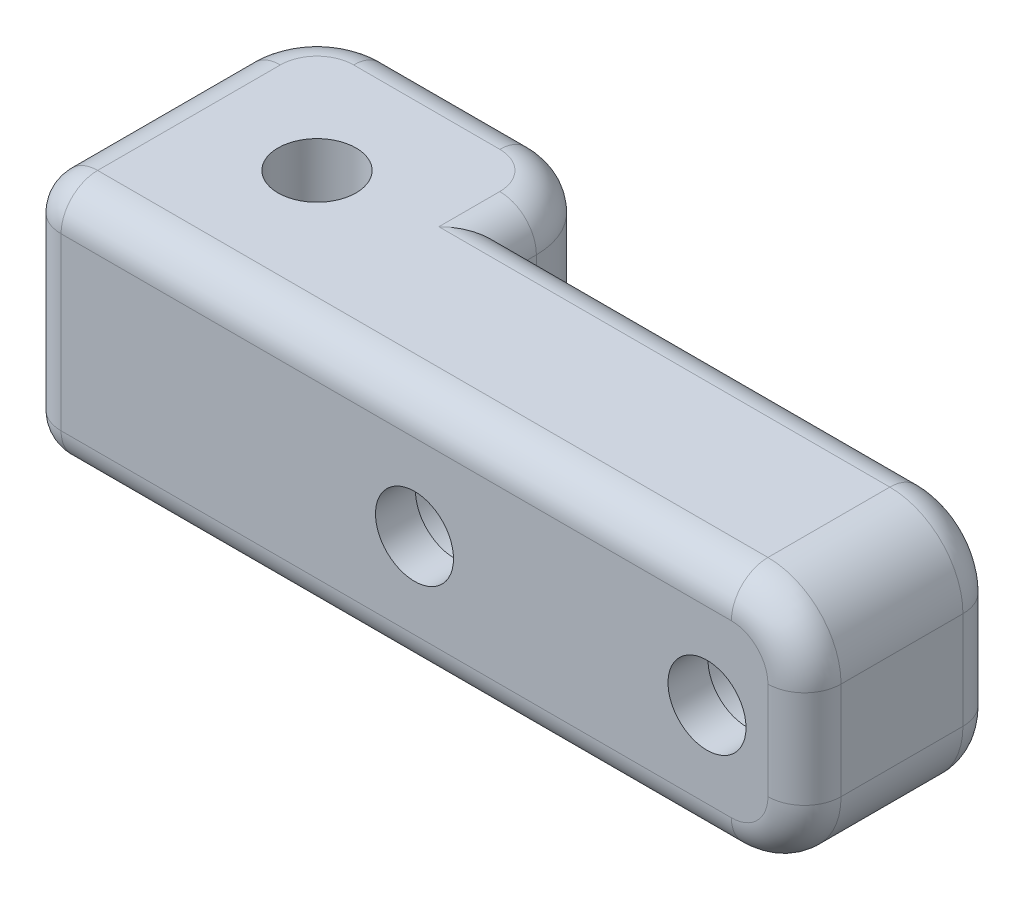
ISO-10303-21;
HEADER;
FILE_DESCRIPTION(('STEP AP214'),'2;1');
FILE_NAME('part.step','',(''),(''),'','','');
FILE_SCHEMA(('AUTOMOTIVE_DESIGN { 1 0 10303 214 1 1 1 1 }'));
ENDSEC;
DATA;
#1=APPLICATION_CONTEXT('core data for automotive mechanical design processes');
#2=APPLICATION_PROTOCOL_DEFINITION('international standard','automotive_design',2000,#1);
#3=PRODUCT_CONTEXT('',#1,'mechanical');
#4=PRODUCT('Part','Part','',(#3));
#5=PRODUCT_RELATED_PRODUCT_CATEGORY('part','',(#4));
#6=PRODUCT_DEFINITION_FORMATION('','',#4);
#7=PRODUCT_DEFINITION_CONTEXT('part definition',#1,'design');
#8=PRODUCT_DEFINITION('design','',#6,#7);
#9=PRODUCT_DEFINITION_SHAPE('','',#8);
#10=(LENGTH_UNIT() NAMED_UNIT(*) SI_UNIT(.MILLI.,.METRE.));
#11=(NAMED_UNIT(*) PLANE_ANGLE_UNIT() SI_UNIT($,.RADIAN.));
#12=(NAMED_UNIT(*) SI_UNIT($,.STERADIAN.) SOLID_ANGLE_UNIT());
#13=UNCERTAINTY_MEASURE_WITH_UNIT(LENGTH_MEASURE(1.E-05),#10,'distance_accuracy_value','');
#14=(GEOMETRIC_REPRESENTATION_CONTEXT(3) GLOBAL_UNCERTAINTY_ASSIGNED_CONTEXT((#13)) GLOBAL_UNIT_ASSIGNED_CONTEXT((#10,
#11,#12)) REPRESENTATION_CONTEXT('',''));
#15=CARTESIAN_POINT('',(0.,0.,0.));
#16=DIRECTION('',(0.,0.,1.));
#17=DIRECTION('',(1.,0.,0.));
#18=AXIS2_PLACEMENT_3D('',#15,#16,#17);
#19=CARTESIAN_POINT('',(12.,-10.,0.));
#20=DIRECTION('',(-1.,0.,0.));
#21=DIRECTION('',(0.,0.,1.));
#22=AXIS2_PLACEMENT_3D('',#19,#20,#21);
#23=PLANE('',#22);
#24=DIRECTION('',(0.,-1.,0.));
#25=VECTOR('',#24,1.);
#26=CARTESIAN_POINT('',(12.,-10.,-8.));
#27=LINE('',#26,#25);
#28=CARTESIAN_POINT('',(12.,-1.5,-8.));
#29=VERTEX_POINT('',#28);
#30=CARTESIAN_POINT('',(12.,-8.5,-8.));
#31=VERTEX_POINT('',#30);
#32=EDGE_CURVE('E502',#29,#31,#27,.T.);
#33=ORIENTED_EDGE('',*,*,#32,.T.);
#34=DIRECTION('',(0.,0.,-1.));
#35=VECTOR('',#34,1.);
#36=CARTESIAN_POINT('',(12.,-8.5,0.));
#37=LINE('',#36,#35);
#38=CARTESIAN_POINT('',(12.,-8.5,-9.));
#39=VERTEX_POINT('',#38);
#40=EDGE_CURVE('E232',#39,#31,#37,.F.);
#41=ORIENTED_EDGE('',*,*,#40,.F.);
#42=DIRECTION('',(0.,1.,0.));
#43=VECTOR('',#42,1.);
#44=CARTESIAN_POINT('',(12.,-10.,-9.));
#45=LINE('',#44,#43);
#46=CARTESIAN_POINT('',(12.,-1.5,-9.));
#47=VERTEX_POINT('',#46);
#48=EDGE_CURVE('E215',#47,#39,#45,.F.);
#49=ORIENTED_EDGE('',*,*,#48,.F.);
#50=DIRECTION('',(0.,0.,-1.));
#51=VECTOR('',#50,1.);
#52=CARTESIAN_POINT('',(12.,-1.5,-9.));
#53=LINE('',#52,#51);
#54=EDGE_CURVE('E224',#29,#47,#53,.T.);
#55=ORIENTED_EDGE('',*,*,#54,.F.);
#56=EDGE_LOOP('',(#33,#41,#49,#55));
#57=FACE_BOUND('',#56,.T.);
#58=ADVANCED_FACE('F47',(#57),#23,.F.);
#59=CARTESIAN_POINT('',(0.,-10.,0.));
#60=DIRECTION('',(1.,0.,0.));
#61=DIRECTION('',(0.,0.,-1.));
#62=AXIS2_PLACEMENT_3D('',#59,#60,#61);
#63=PLANE('',#62);
#64=DIRECTION('',(0.,1.,0.));
#65=VECTOR('',#64,1.);
#66=CARTESIAN_POINT('',(0.,-10.,-9.));
#67=LINE('',#66,#65);
#68=CARTESIAN_POINT('',(0.,-8.5,-9.));
#69=VERTEX_POINT('',#68);
#70=CARTESIAN_POINT('',(0.,-1.5,-9.));
#71=VERTEX_POINT('',#70);
#72=EDGE_CURVE('E505',#69,#71,#67,.T.);
#73=ORIENTED_EDGE('',*,*,#72,.F.);
#74=DIRECTION('',(0.,0.,1.));
#75=VECTOR('',#74,1.);
#76=CARTESIAN_POINT('',(0.,-8.5,0.));
#77=LINE('',#76,#75);
#78=CARTESIAN_POINT('',(0.,-8.5,-1.5));
#79=VERTEX_POINT('',#78);
#80=EDGE_CURVE('E57',#79,#69,#77,.F.);
#81=ORIENTED_EDGE('',*,*,#80,.F.);
#82=DIRECTION('',(0.,1.,0.));
#83=VECTOR('',#82,1.);
#84=CARTESIAN_POINT('',(0.,-10.,-1.5));
#85=LINE('',#84,#83);
#86=CARTESIAN_POINT('',(0.,-1.5,-1.5));
#87=VERTEX_POINT('',#86);
#88=EDGE_CURVE('E405',#87,#79,#85,.F.);
#89=ORIENTED_EDGE('',*,*,#88,.F.);
#90=DIRECTION('',(0.,0.,1.));
#91=VECTOR('',#90,1.);
#92=CARTESIAN_POINT('',(0.,-1.5,0.));
#93=LINE('',#92,#91);
#94=EDGE_CURVE('E11',#71,#87,#93,.T.);
#95=ORIENTED_EDGE('',*,*,#94,.F.);
#96=EDGE_LOOP('',(#73,#81,#89,#95));
#97=FACE_BOUND('',#96,.T.);
#98=ADVANCED_FACE('F537',(#97),#63,.F.);
#99=CARTESIAN_POINT('',(0.,-10.,0.));
#100=DIRECTION('',(0.,0.,-1.));
#101=DIRECTION('',(-1.,0.,0.));
#102=AXIS2_PLACEMENT_3D('',#99,#100,#101);
#103=PLANE('',#102);
#104=DIRECTION('',(0.,1.,0.));
#105=VECTOR('',#104,1.);
#106=CARTESIAN_POINT('',(1.5,-10.,0.));
#107=LINE('',#106,#105);
#108=CARTESIAN_POINT('',(1.5,-8.5,0.));
#109=VERTEX_POINT('',#108);
#110=CARTESIAN_POINT('',(1.5,-1.5,0.));
#111=VERTEX_POINT('',#110);
#112=EDGE_CURVE('E381',#109,#111,#107,.T.);
#113=ORIENTED_EDGE('',*,*,#112,.F.);
#114=DIRECTION('',(1.,0.,0.));
#115=VECTOR('',#114,1.);
#116=CARTESIAN_POINT('',(0.,-8.5,0.));
#117=LINE('',#116,#115);
#118=CARTESIAN_POINT('',(29.,-8.5,0.));
#119=VERTEX_POINT('',#118);
#120=EDGE_CURVE('E385',#119,#109,#117,.F.);
#121=ORIENTED_EDGE('',*,*,#120,.F.);
#122=CARTESIAN_POINT('',(29.,-7.,0.));
#123=DIRECTION('',(0.,0.,1.));
#124=DIRECTION('',(-1.,0.,0.));
#125=AXIS2_PLACEMENT_3D('',#122,#123,#124);
#126=CIRCLE('',#125,1.5);
#127=CARTESIAN_POINT('',(30.5,-7.,0.));
#128=VERTEX_POINT('',#127);
#129=EDGE_CURVE('E389',#128,#119,#126,.F.);
#130=ORIENTED_EDGE('',*,*,#129,.F.);
#131=DIRECTION('',(0.,1.,0.));
#132=VECTOR('',#131,1.);
#133=CARTESIAN_POINT('',(30.5,-7.,0.));
#134=LINE('',#133,#132);
#135=CARTESIAN_POINT('',(30.5,-3.,0.));
#136=VERTEX_POINT('',#135);
#137=EDGE_CURVE('E393',#136,#128,#134,.F.);
#138=ORIENTED_EDGE('',*,*,#137,.F.);
#139=CARTESIAN_POINT('',(29.,-3.,0.));
#140=DIRECTION('',(0.,0.,1.));
#141=DIRECTION('',(-1.,0.,0.));
#142=AXIS2_PLACEMENT_3D('',#139,#140,#141);
#143=CIRCLE('',#142,1.5);
#144=CARTESIAN_POINT('',(29.,-1.5,0.));
#145=VERTEX_POINT('',#144);
#146=EDGE_CURVE('E397',#145,#136,#143,.F.);
#147=ORIENTED_EDGE('',*,*,#146,.F.);
#148=DIRECTION('',(1.,0.,0.));
#149=VECTOR('',#148,1.);
#150=CARTESIAN_POINT('',(29.,-1.5,0.));
#151=LINE('',#150,#149);
#152=EDGE_CURVE('E401',#111,#145,#151,.T.);
#153=ORIENTED_EDGE('',*,*,#152,.F.);
#154=EDGE_LOOP('',(#113,#121,#130,#138,#147,#153));
#155=FACE_BOUND('',#154,.T.);
#156=CARTESIAN_POINT('',(28.,-5.,0.));
#157=DIRECTION('',(0.,0.,-1.));
#158=DIRECTION('',(1.,0.,0.));
#159=AXIS2_PLACEMENT_3D('',#156,#157,#158);
#160=CIRCLE('',#159,1.59999999999999);
#161=CARTESIAN_POINT('',(29.6,-5.,0.));
#162=VERTEX_POINT('',#161);
#163=EDGE_CURVE('E258',#162,#162,#160,.T.);
#164=ORIENTED_EDGE('',*,*,#163,.T.);
#165=EDGE_LOOP('',(#164));
#166=FACE_BOUND('',#165,.T.);
#167=CARTESIAN_POINT('',(16.,-5.,0.));
#168=DIRECTION('',(0.,0.,-1.));
#169=DIRECTION('',(1.,0.,0.));
#170=AXIS2_PLACEMENT_3D('',#167,#168,#169);
#171=CIRCLE('',#170,1.59999999999999);
#172=CARTESIAN_POINT('',(17.6,-5.,0.));
#173=VERTEX_POINT('',#172);
#174=EDGE_CURVE('E498',#173,#173,#171,.T.);
#175=ORIENTED_EDGE('',*,*,#174,.T.);
#176=EDGE_LOOP('',(#175));
#177=FACE_BOUND('',#176,.T.);
#178=ADVANCED_FACE('F601',(#155,#166,#177),#103,.F.);
#179=CARTESIAN_POINT('',(0.,-10.,-12.));
#180=DIRECTION('',(0.,0.,1.));
#181=DIRECTION('',(1.,0.,0.));
#182=AXIS2_PLACEMENT_3D('',#179,#180,#181);
#183=PLANE('',#182);
#184=DIRECTION('',(0.,1.,0.));
#185=VECTOR('',#184,1.);
#186=CARTESIAN_POINT('',(9.,-10.,-12.));
#187=LINE('',#186,#185);
#188=CARTESIAN_POINT('',(9.,-8.5,-12.));
#189=VERTEX_POINT('',#188);
#190=CARTESIAN_POINT('',(9.,-1.5,-12.));
#191=VERTEX_POINT('',#190);
#192=EDGE_CURVE('E218',#189,#191,#187,.T.);
#193=ORIENTED_EDGE('',*,*,#192,.F.);
#194=DIRECTION('',(-1.,0.,0.));
#195=VECTOR('',#194,1.);
#196=CARTESIAN_POINT('',(0.,-8.5,-12.));
#197=LINE('',#196,#195);
#198=CARTESIAN_POINT('',(3.,-8.5,-12.));
#199=VERTEX_POINT('',#198);
#200=EDGE_CURVE('E220',#199,#189,#197,.F.);
#201=ORIENTED_EDGE('',*,*,#200,.F.);
#202=DIRECTION('',(0.,1.,0.));
#203=VECTOR('',#202,1.);
#204=CARTESIAN_POINT('',(3.,-10.,-12.));
#205=LINE('',#204,#203);
#206=CARTESIAN_POINT('',(3.,-1.5,-12.));
#207=VERTEX_POINT('',#206);
#208=EDGE_CURVE('E247',#207,#199,#205,.F.);
#209=ORIENTED_EDGE('',*,*,#208,.F.);
#210=DIRECTION('',(-1.,0.,0.));
#211=VECTOR('',#210,1.);
#212=CARTESIAN_POINT('',(3.,-1.5,-12.));
#213=LINE('',#212,#211);
#214=EDGE_CURVE('E298',#191,#207,#213,.T.);
#215=ORIENTED_EDGE('',*,*,#214,.F.);
#216=EDGE_LOOP('',(#193,#201,#209,#215));
#217=FACE_BOUND('',#216,.T.);
#218=ADVANCED_FACE('F523',(#217),#183,.F.);
#219=CARTESIAN_POINT('',(0.,-10.,0.));
#220=DIRECTION('',(0.,1.,0.));
#221=DIRECTION('',(0.,0.,-1.));
#222=AXIS2_PLACEMENT_3D('',#219,#220,#221);
#223=PLANE('',#222);
#224=CARTESIAN_POINT('',(6.,-10.,-6.));
#225=DIRECTION('',(0.,1.,0.));
#226=DIRECTION('',(0.,0.,1.));
#227=AXIS2_PLACEMENT_3D('',#224,#225,#226);
#228=CIRCLE('',#227,2.20000000000001);
#229=CARTESIAN_POINT('',(6.,-10.,-3.79999999999999));
#230=VERTEX_POINT('',#229);
#231=EDGE_CURVE('E1039',#230,#230,#228,.T.);
#232=ORIENTED_EDGE('',*,*,#231,.T.);
#233=EDGE_LOOP('',(#232));
#234=FACE_BOUND('',#233,.T.);
#235=DIRECTION('',(0.,0.,1.));
#236=VECTOR('',#235,1.);
#237=CARTESIAN_POINT('',(29.,-10.,-8.));
#238=LINE('',#237,#236);
#239=CARTESIAN_POINT('',(29.,-10.,-1.5));
#240=VERTEX_POINT('',#239);
#241=CARTESIAN_POINT('',(29.,-10.,-6.5));
#242=VERTEX_POINT('',#241);
#243=EDGE_CURVE('E237',#240,#242,#238,.F.);
#244=ORIENTED_EDGE('',*,*,#243,.F.);
#245=DIRECTION('',(1.,0.,0.));
#246=VECTOR('',#245,1.);
#247=CARTESIAN_POINT('',(0.,-10.,-1.5));
#248=LINE('',#247,#246);
#249=CARTESIAN_POINT('',(1.5,-10.,-1.5));
#250=VERTEX_POINT('',#249);
#251=EDGE_CURVE('E353',#250,#240,#248,.T.);
#252=ORIENTED_EDGE('',*,*,#251,.F.);
#253=DIRECTION('',(0.,0.,1.));
#254=VECTOR('',#253,1.);
#255=CARTESIAN_POINT('',(1.5,-10.,0.));
#256=LINE('',#255,#254);
#257=CARTESIAN_POINT('',(1.5,-10.,-9.));
#258=VERTEX_POINT('',#257);
#259=EDGE_CURVE('E357',#258,#250,#256,.T.);
#260=ORIENTED_EDGE('',*,*,#259,.F.);
#261=CARTESIAN_POINT('',(3.,-10.,-9.));
#262=DIRECTION('',(0.,-1.,0.));
#263=DIRECTION('',(0.,0.,-1.));
#264=AXIS2_PLACEMENT_3D('',#261,#262,#263);
#265=CIRCLE('',#264,1.5);
#266=CARTESIAN_POINT('',(3.,-10.,-10.5));
#267=VERTEX_POINT('',#266);
#268=EDGE_CURVE('E361',#267,#258,#265,.F.);
#269=ORIENTED_EDGE('',*,*,#268,.F.);
#270=DIRECTION('',(-1.,0.,0.));
#271=VECTOR('',#270,1.);
#272=CARTESIAN_POINT('',(0.,-10.,-10.5));
#273=LINE('',#272,#271);
#274=CARTESIAN_POINT('',(9.,-10.,-10.5));
#275=VERTEX_POINT('',#274);
#276=EDGE_CURVE('E365',#275,#267,#273,.T.);
#277=ORIENTED_EDGE('',*,*,#276,.F.);
#278=CARTESIAN_POINT('',(9.,-10.,-9.));
#279=DIRECTION('',(0.,-1.,0.));
#280=DIRECTION('',(0.,0.,-1.));
#281=AXIS2_PLACEMENT_3D('',#278,#279,#280);
#282=CIRCLE('',#281,1.5);
#283=CARTESIAN_POINT('',(10.5,-10.,-9.));
#284=VERTEX_POINT('',#283);
#285=EDGE_CURVE('E369',#284,#275,#282,.F.);
#286=ORIENTED_EDGE('',*,*,#285,.F.);
#287=DIRECTION('',(0.,0.,-1.));
#288=VECTOR('',#287,1.);
#289=CARTESIAN_POINT('',(10.5,-10.,0.));
#290=LINE('',#289,#288);
#291=CARTESIAN_POINT('',(10.5,-10.,-6.5));
#292=VERTEX_POINT('',#291);
#293=EDGE_CURVE('E373',#292,#284,#290,.T.);
#294=ORIENTED_EDGE('',*,*,#293,.F.);
#295=DIRECTION('',(-1.,0.,0.));
#296=VECTOR('',#295,1.);
#297=CARTESIAN_POINT('',(0.,-10.,-6.5));
#298=LINE('',#297,#296);
#299=EDGE_CURVE('E377',#242,#292,#298,.T.);
#300=ORIENTED_EDGE('',*,*,#299,.F.);
#301=EDGE_LOOP('',(#244,#252,#260,#269,#277,#286,#294,#300));
#302=FACE_BOUND('',#301,.T.);
#303=ADVANCED_FACE('F581',(#234,#302),#223,.F.);
#304=CARTESIAN_POINT('',(0.,0.,0.));
#305=DIRECTION('',(0.,1.,0.));
#306=DIRECTION('',(0.,0.,-1.));
#307=AXIS2_PLACEMENT_3D('',#304,#305,#306);
#308=PLANE('',#307);
#309=CARTESIAN_POINT('',(6.,0.,-6.));
#310=DIRECTION('',(0.,-1.,0.));
#311=DIRECTION('',(0.,0.,-1.));
#312=AXIS2_PLACEMENT_3D('',#309,#310,#311);
#313=CIRCLE('',#312,1.60000000000001);
#314=CARTESIAN_POINT('',(6.,0.,-7.60000000000001));
#315=VERTEX_POINT('',#314);
#316=EDGE_CURVE('E51',#315,#315,#313,.T.);
#317=ORIENTED_EDGE('',*,*,#316,.T.);
#318=EDGE_LOOP('',(#317));
#319=FACE_BOUND('',#318,.T.);
#320=DIRECTION('',(0.,0.,-1.));
#321=VECTOR('',#320,1.);
#322=CARTESIAN_POINT('',(10.5,0.,-8.));
#323=LINE('',#322,#321);
#324=CARTESIAN_POINT('',(10.5,0.,-9.));
#325=VERTEX_POINT('',#324);
#326=CARTESIAN_POINT('',(10.5,0.,-6.5));
#327=VERTEX_POINT('',#326);
#328=EDGE_CURVE('E285',#325,#327,#323,.F.);
#329=ORIENTED_EDGE('',*,*,#328,.F.);
#330=CARTESIAN_POINT('',(9.,0.,-9.));
#331=DIRECTION('',(0.,-1.,0.));
#332=DIRECTION('',(0.,0.,-1.));
#333=AXIS2_PLACEMENT_3D('',#330,#331,#332);
#334=CIRCLE('',#333,1.5);
#335=CARTESIAN_POINT('',(9.,0.,-10.5));
#336=VERTEX_POINT('',#335);
#337=EDGE_CURVE('E201',#336,#325,#334,.T.);
#338=ORIENTED_EDGE('',*,*,#337,.F.);
#339=DIRECTION('',(-1.,0.,0.));
#340=VECTOR('',#339,1.);
#341=CARTESIAN_POINT('',(9.,0.,-10.5));
#342=LINE('',#341,#340);
#343=CARTESIAN_POINT('',(3.,0.,-10.5));
#344=VERTEX_POINT('',#343);
#345=EDGE_CURVE('E279',#344,#336,#342,.F.);
#346=ORIENTED_EDGE('',*,*,#345,.F.);
#347=CARTESIAN_POINT('',(3.,0.,-9.));
#348=DIRECTION('',(0.,-1.,0.));
#349=DIRECTION('',(0.,0.,-1.));
#350=AXIS2_PLACEMENT_3D('',#347,#348,#349);
#351=CIRCLE('',#350,1.5);
#352=CARTESIAN_POINT('',(1.5,0.,-9.));
#353=VERTEX_POINT('',#352);
#354=EDGE_CURVE('E275',#353,#344,#351,.T.);
#355=ORIENTED_EDGE('',*,*,#354,.F.);
#356=DIRECTION('',(0.,0.,1.));
#357=VECTOR('',#356,1.);
#358=CARTESIAN_POINT('',(1.5,0.,-9.));
#359=LINE('',#358,#357);
#360=CARTESIAN_POINT('',(1.5,0.,-1.5));
#361=VERTEX_POINT('',#360);
#362=EDGE_CURVE('E231',#361,#353,#359,.F.);
#363=ORIENTED_EDGE('',*,*,#362,.F.);
#364=DIRECTION('',(1.,0.,0.));
#365=VECTOR('',#364,1.);
#366=CARTESIAN_POINT('',(0.,0.,-1.5));
#367=LINE('',#366,#365);
#368=CARTESIAN_POINT('',(29.,0.,-1.5));
#369=VERTEX_POINT('',#368);
#370=EDGE_CURVE('E271',#369,#361,#367,.F.);
#371=ORIENTED_EDGE('',*,*,#370,.F.);
#372=DIRECTION('',(0.,0.,-1.));
#373=VECTOR('',#372,1.);
#374=CARTESIAN_POINT('',(29.,0.,0.));
#375=LINE('',#374,#373);
#376=CARTESIAN_POINT('',(29.,0.,-6.5));
#377=VERTEX_POINT('',#376);
#378=EDGE_CURVE('E509',#377,#369,#375,.F.);
#379=ORIENTED_EDGE('',*,*,#378,.F.);
#380=DIRECTION('',(-1.,0.,0.));
#381=VECTOR('',#380,1.);
#382=CARTESIAN_POINT('',(29.,0.,-6.5));
#383=LINE('',#382,#381);
#384=EDGE_CURVE('E288',#327,#377,#383,.F.);
#385=ORIENTED_EDGE('',*,*,#384,.F.);
#386=EDGE_LOOP('',(#329,#338,#346,#355,#363,#371,#379,#385));
#387=FACE_BOUND('',#386,.T.);
#388=ADVANCED_FACE('F548',(#319,#387),#308,.T.);
#389=CARTESIAN_POINT('',(32.,-10.,-8.));
#390=DIRECTION('',(0.,0.,1.));
#391=DIRECTION('',(0.,1.,0.));
#392=AXIS2_PLACEMENT_3D('',#389,#390,#391);
#393=PLANE('',#392);
#394=CARTESIAN_POINT('',(28.,-5.,-8.));
#395=DIRECTION('',(0.,0.,1.));
#396=DIRECTION('',(0.,-1.,0.));
#397=AXIS2_PLACEMENT_3D('',#394,#395,#396);
#398=CIRCLE('',#397,2.19999999999999);
#399=CARTESIAN_POINT('',(28.,-7.19999999999999,-8.));
#400=VERTEX_POINT('',#399);
#401=EDGE_CURVE('E475',#400,#400,#398,.T.);
#402=ORIENTED_EDGE('',*,*,#401,.T.);
#403=EDGE_LOOP('',(#402));
#404=FACE_BOUND('',#403,.T.);
#405=CARTESIAN_POINT('',(16.,-5.,-8.));
#406=DIRECTION('',(0.,0.,1.));
#407=DIRECTION('',(0.,-1.,0.));
#408=AXIS2_PLACEMENT_3D('',#405,#406,#407);
#409=CIRCLE('',#408,2.19999999999999);
#410=CARTESIAN_POINT('',(16.,-7.19999999999999,-8.));
#411=VERTEX_POINT('',#410);
#412=EDGE_CURVE('E264',#411,#411,#409,.T.);
#413=ORIENTED_EDGE('',*,*,#412,.T.);
#414=EDGE_LOOP('',(#413));
#415=FACE_BOUND('',#414,.T.);
#416=CARTESIAN_POINT('',(29.,-3.,-8.));
#417=DIRECTION('',(0.,0.,-1.));
#418=DIRECTION('',(0.,1.,0.));
#419=AXIS2_PLACEMENT_3D('',#416,#417,#418);
#420=CIRCLE('',#419,1.5);
#421=CARTESIAN_POINT('',(30.5,-3.,-8.));
#422=VERTEX_POINT('',#421);
#423=CARTESIAN_POINT('',(29.,-1.5,-8.));
#424=VERTEX_POINT('',#423);
#425=EDGE_CURVE('E322',#422,#424,#420,.F.);
#426=ORIENTED_EDGE('',*,*,#425,.F.);
#427=DIRECTION('',(0.,-1.,0.));
#428=VECTOR('',#427,1.);
#429=CARTESIAN_POINT('',(30.5,-3.,-8.));
#430=LINE('',#429,#428);
#431=CARTESIAN_POINT('',(30.5,-7.,-8.));
#432=VERTEX_POINT('',#431);
#433=EDGE_CURVE('E318',#432,#422,#430,.F.);
#434=ORIENTED_EDGE('',*,*,#433,.F.);
#435=CARTESIAN_POINT('',(29.,-7.,-8.));
#436=DIRECTION('',(0.,0.,-1.));
#437=DIRECTION('',(0.,1.,0.));
#438=AXIS2_PLACEMENT_3D('',#435,#436,#437);
#439=CIRCLE('',#438,1.5);
#440=CARTESIAN_POINT('',(29.,-8.5,-8.));
#441=VERTEX_POINT('',#440);
#442=EDGE_CURVE('E314',#441,#432,#439,.F.);
#443=ORIENTED_EDGE('',*,*,#442,.F.);
#444=DIRECTION('',(-1.,0.,0.));
#445=VECTOR('',#444,1.);
#446=CARTESIAN_POINT('',(32.,-8.5,-8.));
#447=LINE('',#446,#445);
#448=EDGE_CURVE('E310',#31,#441,#447,.F.);
#449=ORIENTED_EDGE('',*,*,#448,.F.);
#450=ORIENTED_EDGE('',*,*,#32,.F.);
#451=DIRECTION('',(-1.,0.,0.));
#452=VECTOR('',#451,1.);
#453=CARTESIAN_POINT('',(12.,-1.5,-8.));
#454=LINE('',#453,#452);
#455=EDGE_CURVE('E326',#424,#29,#454,.T.);
#456=ORIENTED_EDGE('',*,*,#455,.F.);
#457=EDGE_LOOP('',(#426,#434,#443,#449,#450,#456));
#458=FACE_BOUND('',#457,.T.);
#459=ADVANCED_FACE('F557',(#404,#415,#458),#393,.F.);
#460=CARTESIAN_POINT('',(32.,0.,0.));
#461=DIRECTION('',(1.,0.,0.));
#462=DIRECTION('',(0.,0.,-1.));
#463=AXIS2_PLACEMENT_3D('',#460,#461,#462);
#464=PLANE('',#463);
#465=DIRECTION('',(0.,0.,-1.));
#466=VECTOR('',#465,1.);
#467=CARTESIAN_POINT('',(32.,-3.,0.));
#468=LINE('',#467,#466);
#469=CARTESIAN_POINT('',(32.,-3.,-1.5));
#470=VERTEX_POINT('',#469);
#471=CARTESIAN_POINT('',(32.,-3.,-6.5));
#472=VERTEX_POINT('',#471);
#473=EDGE_CURVE('E243',#470,#472,#468,.T.);
#474=ORIENTED_EDGE('',*,*,#473,.F.);
#475=DIRECTION('',(0.,1.,0.));
#476=VECTOR('',#475,1.);
#477=CARTESIAN_POINT('',(32.,-3.,-1.5));
#478=LINE('',#477,#476);
#479=CARTESIAN_POINT('',(32.,-7.,-1.5));
#480=VERTEX_POINT('',#479);
#481=EDGE_CURVE('E337',#480,#470,#478,.T.);
#482=ORIENTED_EDGE('',*,*,#481,.F.);
#483=DIRECTION('',(0.,0.,1.));
#484=VECTOR('',#483,1.);
#485=CARTESIAN_POINT('',(32.,-7.,0.));
#486=LINE('',#485,#484);
#487=CARTESIAN_POINT('',(32.,-7.,-6.5));
#488=VERTEX_POINT('',#487);
#489=EDGE_CURVE('E236',#488,#480,#486,.T.);
#490=ORIENTED_EDGE('',*,*,#489,.F.);
#491=DIRECTION('',(0.,-1.,0.));
#492=VECTOR('',#491,1.);
#493=CARTESIAN_POINT('',(32.,-7.,-6.5));
#494=LINE('',#493,#492);
#495=EDGE_CURVE('E341',#472,#488,#494,.T.);
#496=ORIENTED_EDGE('',*,*,#495,.F.);
#497=EDGE_LOOP('',(#474,#482,#490,#496));
#498=FACE_BOUND('',#497,.T.);
#499=ADVANCED_FACE('F960',(#498),#464,.T.);
#500=CARTESIAN_POINT('',(16.,-5.,0.));
#501=DIRECTION('',(0.,0.,1.));
#502=DIRECTION('',(1.,0.,0.));
#503=AXIS2_PLACEMENT_3D('',#500,#501,#502);
#504=CYLINDRICAL_SURFACE('',#503,1.59999999999999);
#505=CARTESIAN_POINT('',(16.,-5.,-1.63948362858346));
#506=DIRECTION('',(0.,0.,1.));
#507=DIRECTION('',(0.,-1.,0.));
#508=AXIS2_PLACEMENT_3D('',#505,#506,#507);
#509=CIRCLE('',#508,1.59999999999999);
#510=CARTESIAN_POINT('',(16.,-6.59999999999999,-1.63948362858346));
#511=VERTEX_POINT('',#510);
#512=EDGE_CURVE('E254',#511,#511,#509,.T.);
#513=ORIENTED_EDGE('',*,*,#512,.F.);
#514=EDGE_LOOP('',(#513));
#515=FACE_BOUND('',#514,.T.);
#516=ORIENTED_EDGE('',*,*,#174,.F.);
#517=EDGE_LOOP('',(#516));
#518=FACE_BOUND('',#517,.T.);
#519=ADVANCED_FACE('F949',(#515,#518),#504,.F.);
#520=CARTESIAN_POINT('',(28.,-5.,0.));
#521=DIRECTION('',(0.,0.,1.));
#522=DIRECTION('',(1.,0.,0.));
#523=AXIS2_PLACEMENT_3D('',#520,#521,#522);
#524=CYLINDRICAL_SURFACE('',#523,1.59999999999999);
#525=CARTESIAN_POINT('',(28.,-5.,-1.63948362858346));
#526=DIRECTION('',(0.,0.,1.));
#527=DIRECTION('',(0.,-1.,0.));
#528=AXIS2_PLACEMENT_3D('',#525,#526,#527);
#529=CIRCLE('',#528,1.59999999999999);
#530=CARTESIAN_POINT('',(28.,-6.59999999999999,-1.63948362858346));
#531=VERTEX_POINT('',#530);
#532=EDGE_CURVE('E260',#531,#531,#529,.T.);
#533=ORIENTED_EDGE('',*,*,#532,.F.);
#534=EDGE_LOOP('',(#533));
#535=FACE_BOUND('',#534,.T.);
#536=ORIENTED_EDGE('',*,*,#163,.F.);
#537=EDGE_LOOP('',(#536));
#538=FACE_BOUND('',#537,.T.);
#539=ADVANCED_FACE('F611',(#535,#538),#524,.F.);
#540=CARTESIAN_POINT('',(3.,-10.,-9.));
#541=DIRECTION('',(0.,1.,0.));
#542=DIRECTION('',(0.,0.,-1.));
#543=AXIS2_PLACEMENT_3D('',#540,#541,#542);
#544=CYLINDRICAL_SURFACE('',#543,3.);
#545=ORIENTED_EDGE('',*,*,#208,.T.);
#546=CARTESIAN_POINT('',(3.,-8.5,-9.));
#547=DIRECTION('',(0.,-1.,0.));
#548=DIRECTION('',(0.,0.,-1.));
#549=AXIS2_PLACEMENT_3D('',#546,#547,#548);
#550=CIRCLE('',#549,3.);
#551=EDGE_CURVE('E302',#69,#199,#550,.T.);
#552=ORIENTED_EDGE('',*,*,#551,.F.);
#553=ORIENTED_EDGE('',*,*,#72,.T.);
#554=CARTESIAN_POINT('',(3.,-1.5,-9.));
#555=DIRECTION('',(0.,-1.,0.));
#556=DIRECTION('',(0.,0.,-1.));
#557=AXIS2_PLACEMENT_3D('',#554,#555,#556);
#558=CIRCLE('',#557,3.);
#559=EDGE_CURVE('E306',#207,#71,#558,.F.);
#560=ORIENTED_EDGE('',*,*,#559,.F.);
#561=EDGE_LOOP('',(#545,#552,#553,#560));
#562=FACE_BOUND('',#561,.T.);
#563=ADVANCED_FACE('F521',(#562),#544,.T.);
#564=CARTESIAN_POINT('',(9.,-10.,-9.));
#565=DIRECTION('',(0.,1.,0.));
#566=DIRECTION('',(0.,0.,-1.));
#567=AXIS2_PLACEMENT_3D('',#564,#565,#566);
#568=CYLINDRICAL_SURFACE('',#567,3.);
#569=ORIENTED_EDGE('',*,*,#48,.T.);
#570=CARTESIAN_POINT('',(9.,-8.5,-9.));
#571=DIRECTION('',(0.,-1.,0.));
#572=DIRECTION('',(0.,0.,-1.));
#573=AXIS2_PLACEMENT_3D('',#570,#571,#572);
#574=CIRCLE('',#573,3.);
#575=EDGE_CURVE('E221',#189,#39,#574,.T.);
#576=ORIENTED_EDGE('',*,*,#575,.F.);
#577=ORIENTED_EDGE('',*,*,#192,.T.);
#578=CARTESIAN_POINT('',(9.,-1.5,-9.));
#579=DIRECTION('',(0.,-1.,0.));
#580=DIRECTION('',(0.,0.,-1.));
#581=AXIS2_PLACEMENT_3D('',#578,#579,#580);
#582=CIRCLE('',#581,3.);
#583=EDGE_CURVE('E198',#47,#191,#582,.F.);
#584=ORIENTED_EDGE('',*,*,#583,.F.);
#585=EDGE_LOOP('',(#569,#576,#577,#584));
#586=FACE_BOUND('',#585,.T.);
#587=ADVANCED_FACE('F212',(#586),#568,.T.);
#588=CARTESIAN_POINT('',(29.,-3.,0.));
#589=DIRECTION('',(0.,0.,-1.));
#590=DIRECTION('',(-1.,0.,0.));
#591=AXIS2_PLACEMENT_3D('',#588,#589,#590);
#592=CYLINDRICAL_SURFACE('',#591,3.);
#593=ORIENTED_EDGE('',*,*,#378,.T.);
#594=CARTESIAN_POINT('',(29.,-3.,-1.5));
#595=DIRECTION('',(0.,0.,1.));
#596=DIRECTION('',(-1.,0.,0.));
#597=AXIS2_PLACEMENT_3D('',#594,#595,#596);
#598=CIRCLE('',#597,3.);
#599=EDGE_CURVE('E329',#470,#369,#598,.T.);
#600=ORIENTED_EDGE('',*,*,#599,.F.);
#601=ORIENTED_EDGE('',*,*,#473,.T.);
#602=CARTESIAN_POINT('',(29.,-3.,-6.5));
#603=DIRECTION('',(0.,0.,-1.));
#604=DIRECTION('',(0.,1.,0.));
#605=AXIS2_PLACEMENT_3D('',#602,#603,#604);
#606=CIRCLE('',#605,3.);
#607=EDGE_CURVE('E333',#377,#472,#606,.T.);
#608=ORIENTED_EDGE('',*,*,#607,.F.);
#609=EDGE_LOOP('',(#593,#600,#601,#608));
#610=FACE_BOUND('',#609,.T.);
#611=ADVANCED_FACE('F614',(#610),#592,.T.);
#612=CARTESIAN_POINT('',(29.,-7.,0.));
#613=DIRECTION('',(0.,0.,-1.));
#614=DIRECTION('',(-1.,0.,0.));
#615=AXIS2_PLACEMENT_3D('',#612,#613,#614);
#616=CYLINDRICAL_SURFACE('',#615,3.);
#617=ORIENTED_EDGE('',*,*,#489,.T.);
#618=CARTESIAN_POINT('',(29.,-7.,-1.5));
#619=DIRECTION('',(0.,0.,1.));
#620=DIRECTION('',(-1.,0.,0.));
#621=AXIS2_PLACEMENT_3D('',#618,#619,#620);
#622=CIRCLE('',#621,3.);
#623=EDGE_CURVE('E345',#240,#480,#622,.T.);
#624=ORIENTED_EDGE('',*,*,#623,.F.);
#625=ORIENTED_EDGE('',*,*,#243,.T.);
#626=CARTESIAN_POINT('',(29.,-7.,-6.5));
#627=DIRECTION('',(0.,0.,-1.));
#628=DIRECTION('',(0.,1.,0.));
#629=AXIS2_PLACEMENT_3D('',#626,#627,#628);
#630=CIRCLE('',#629,3.);
#631=EDGE_CURVE('E349',#488,#242,#630,.T.);
#632=ORIENTED_EDGE('',*,*,#631,.F.);
#633=EDGE_LOOP('',(#617,#624,#625,#632));
#634=FACE_BOUND('',#633,.T.);
#635=ADVANCED_FACE('F617',(#634),#616,.T.);
#636=CARTESIAN_POINT('',(16.,-5.,-2.));
#637=DIRECTION('',(0.,0.,-1.));
#638=DIRECTION('',(0.,-1.,0.));
#639=AXIS2_PLACEMENT_3D('',#636,#637,#638);
#640=CONICAL_SURFACE('',#639,2.2,1.02974425867665);
#641=CARTESIAN_POINT('',(16.,-5.,-2.));
#642=DIRECTION('',(0.,0.,1.));
#643=DIRECTION('',(0.,-1.,0.));
#644=AXIS2_PLACEMENT_3D('',#641,#642,#643);
#645=CIRCLE('',#644,2.2);
#646=CARTESIAN_POINT('',(16.,-7.2,-2.));
#647=VERTEX_POINT('',#646);
#648=EDGE_CURVE('E259',#647,#647,#645,.T.);
#649=ORIENTED_EDGE('',*,*,#648,.F.);
#650=EDGE_LOOP('',(#649));
#651=FACE_BOUND('',#650,.T.);
#652=ORIENTED_EDGE('',*,*,#512,.T.);
#653=EDGE_LOOP('',(#652));
#654=FACE_BOUND('',#653,.T.);
#655=ADVANCED_FACE('F621',(#651,#654),#640,.F.);
#656=CARTESIAN_POINT('',(16.,-5.,-8.));
#657=DIRECTION('',(0.,0.,-1.));
#658=DIRECTION('',(0.,-1.,0.));
#659=AXIS2_PLACEMENT_3D('',#656,#657,#658);
#660=CYLINDRICAL_SURFACE('',#659,2.2);
#661=ORIENTED_EDGE('',*,*,#648,.T.);
#662=EDGE_LOOP('',(#661));
#663=FACE_BOUND('',#662,.T.);
#664=ORIENTED_EDGE('',*,*,#412,.F.);
#665=EDGE_LOOP('',(#664));
#666=FACE_BOUND('',#665,.T.);
#667=ADVANCED_FACE('F890',(#663,#666),#660,.F.);
#668=CARTESIAN_POINT('',(28.,-5.,-2.));
#669=DIRECTION('',(0.,0.,-1.));
#670=DIRECTION('',(0.,-1.,0.));
#671=AXIS2_PLACEMENT_3D('',#668,#669,#670);
#672=CONICAL_SURFACE('',#671,2.2,1.02974425867665);
#673=CARTESIAN_POINT('',(28.,-5.,-2.));
#674=DIRECTION('',(0.,0.,1.));
#675=DIRECTION('',(0.,-1.,0.));
#676=AXIS2_PLACEMENT_3D('',#673,#674,#675);
#677=CIRCLE('',#676,2.2);
#678=CARTESIAN_POINT('',(28.,-7.2,-2.));
#679=VERTEX_POINT('',#678);
#680=EDGE_CURVE('E265',#679,#679,#677,.T.);
#681=ORIENTED_EDGE('',*,*,#680,.F.);
#682=EDGE_LOOP('',(#681));
#683=FACE_BOUND('',#682,.T.);
#684=ORIENTED_EDGE('',*,*,#532,.T.);
#685=EDGE_LOOP('',(#684));
#686=FACE_BOUND('',#685,.T.);
#687=ADVANCED_FACE('F879',(#683,#686),#672,.F.);
#688=CARTESIAN_POINT('',(28.,-5.,-8.));
#689=DIRECTION('',(0.,0.,-1.));
#690=DIRECTION('',(0.,-1.,0.));
#691=AXIS2_PLACEMENT_3D('',#688,#689,#690);
#692=CYLINDRICAL_SURFACE('',#691,2.19999999999999);
#693=ORIENTED_EDGE('',*,*,#680,.T.);
#694=EDGE_LOOP('',(#693));
#695=FACE_BOUND('',#694,.T.);
#696=ORIENTED_EDGE('',*,*,#401,.F.);
#697=EDGE_LOOP('',(#696));
#698=FACE_BOUND('',#697,.T.);
#699=ADVANCED_FACE('F869',(#695,#698),#692,.F.);
#700=CARTESIAN_POINT('',(3.,-8.5,-9.));
#701=DIRECTION('',(0.,1.,0.));
#702=DIRECTION('',(0.,0.,-1.));
#703=AXIS2_PLACEMENT_3D('',#700,#701,#702);
#704=DEGENERATE_TOROIDAL_SURFACE('',#703,1.5,1.5,.T.);
#705=CARTESIAN_POINT('',(1.5,-8.5,-9.));
#706=DIRECTION('',(0.,0.,-1.));
#707=DIRECTION('',(1.,0.,0.));
#708=AXIS2_PLACEMENT_3D('',#705,#706,#707);
#709=CIRCLE('',#708,1.5);
#710=EDGE_CURVE('E471',#258,#69,#709,.T.);
#711=ORIENTED_EDGE('',*,*,#710,.T.);
#712=ORIENTED_EDGE('',*,*,#551,.T.);
#713=CARTESIAN_POINT('',(3.,-8.5,-10.5));
#714=DIRECTION('',(-1.,0.,0.));
#715=DIRECTION('',(0.,0.,-1.));
#716=AXIS2_PLACEMENT_3D('',#713,#714,#715);
#717=CIRCLE('',#716,1.5);
#718=EDGE_CURVE('E473',#199,#267,#717,.T.);
#719=ORIENTED_EDGE('',*,*,#718,.T.);
#720=ORIENTED_EDGE('',*,*,#268,.T.);
#721=EDGE_LOOP('',(#711,#712,#719,#720));
#722=FACE_BOUND('',#721,.T.);
#723=ADVANCED_FACE('F49',(#722),#704,.T.);
#724=CARTESIAN_POINT('',(29.,-7.,-1.5));
#725=DIRECTION('',(0.,0.,-1.));
#726=DIRECTION('',(-1.,0.,0.));
#727=AXIS2_PLACEMENT_3D('',#724,#725,#726);
#728=DEGENERATE_TOROIDAL_SURFACE('',#727,1.5,1.5,.T.);
#729=CARTESIAN_POINT('',(30.5,-7.,-1.5));
#730=DIRECTION('',(0.,-1.,0.));
#731=DIRECTION('',(0.,0.,-1.));
#732=AXIS2_PLACEMENT_3D('',#729,#730,#731);
#733=CIRCLE('',#732,1.5);
#734=EDGE_CURVE('E465',#480,#128,#733,.T.);
#735=ORIENTED_EDGE('',*,*,#734,.T.);
#736=ORIENTED_EDGE('',*,*,#129,.T.);
#737=CARTESIAN_POINT('',(29.,-8.5,-1.5));
#738=DIRECTION('',(1.,0.,0.));
#739=DIRECTION('',(0.,0.,1.));
#740=AXIS2_PLACEMENT_3D('',#737,#738,#739);
#741=CIRCLE('',#740,1.5);
#742=EDGE_CURVE('E468',#119,#240,#741,.T.);
#743=ORIENTED_EDGE('',*,*,#742,.T.);
#744=ORIENTED_EDGE('',*,*,#623,.T.);
#745=EDGE_LOOP('',(#735,#736,#743,#744));
#746=FACE_BOUND('',#745,.T.);
#747=ADVANCED_FACE('F849',(#746),#728,.T.);
#748=CARTESIAN_POINT('',(0.,-8.5,-10.5));
#749=DIRECTION('',(-1.,0.,0.));
#750=DIRECTION('',(0.,0.,1.));
#751=AXIS2_PLACEMENT_3D('',#748,#749,#750);
#752=CYLINDRICAL_SURFACE('',#751,1.5);
#753=ORIENTED_EDGE('',*,*,#718,.F.);
#754=ORIENTED_EDGE('',*,*,#200,.T.);
#755=CARTESIAN_POINT('',(9.,-8.5,-10.5));
#756=DIRECTION('',(-1.,0.,0.));
#757=DIRECTION('',(0.,0.,-1.));
#758=AXIS2_PLACEMENT_3D('',#755,#756,#757);
#759=CIRCLE('',#758,1.5);
#760=EDGE_CURVE('E462',#189,#275,#759,.T.);
#761=ORIENTED_EDGE('',*,*,#760,.T.);
#762=ORIENTED_EDGE('',*,*,#276,.T.);
#763=EDGE_LOOP('',(#753,#754,#761,#762));
#764=FACE_BOUND('',#763,.T.);
#765=ADVANCED_FACE('F525',(#764),#752,.T.);
#766=CARTESIAN_POINT('',(1.5,-8.5,0.));
#767=DIRECTION('',(0.,0.,1.));
#768=DIRECTION('',(1.,0.,0.));
#769=AXIS2_PLACEMENT_3D('',#766,#767,#768);
#770=CYLINDRICAL_SURFACE('',#769,1.5);
#771=ORIENTED_EDGE('',*,*,#710,.F.);
#772=ORIENTED_EDGE('',*,*,#259,.T.);
#773=CARTESIAN_POINT('',(1.5,-8.5,-1.5));
#774=DIRECTION('',(0.,0.,-1.));
#775=DIRECTION('',(1.,0.,0.));
#776=AXIS2_PLACEMENT_3D('',#773,#774,#775);
#777=CIRCLE('',#776,1.5);
#778=EDGE_CURVE('E459',#250,#79,#777,.T.);
#779=ORIENTED_EDGE('',*,*,#778,.T.);
#780=ORIENTED_EDGE('',*,*,#80,.T.);
#781=EDGE_LOOP('',(#771,#772,#779,#780));
#782=FACE_BOUND('',#781,.T.);
#783=ADVANCED_FACE('F530',(#782),#770,.T.);
#784=CARTESIAN_POINT('',(0.,-8.5,-1.5));
#785=DIRECTION('',(1.,0.,0.));
#786=DIRECTION('',(0.,0.,-1.));
#787=AXIS2_PLACEMENT_3D('',#784,#785,#786);
#788=CYLINDRICAL_SURFACE('',#787,1.5);
#789=ORIENTED_EDGE('',*,*,#742,.F.);
#790=ORIENTED_EDGE('',*,*,#120,.T.);
#791=CARTESIAN_POINT('',(1.5,-8.5,-1.5));
#792=DIRECTION('',(1.,0.,0.));
#793=DIRECTION('',(0.,0.,1.));
#794=AXIS2_PLACEMENT_3D('',#791,#792,#793);
#795=CIRCLE('',#794,1.5);
#796=EDGE_CURVE('E456',#109,#250,#795,.T.);
#797=ORIENTED_EDGE('',*,*,#796,.T.);
#798=ORIENTED_EDGE('',*,*,#251,.T.);
#799=EDGE_LOOP('',(#789,#790,#797,#798));
#800=FACE_BOUND('',#799,.T.);
#801=ADVANCED_FACE('F583',(#800),#788,.T.);
#802=CARTESIAN_POINT('',(30.5,0.,-1.5));
#803=DIRECTION('',(0.,-1.,0.));
#804=DIRECTION('',(0.,0.,1.));
#805=AXIS2_PLACEMENT_3D('',#802,#803,#804);
#806=CYLINDRICAL_SURFACE('',#805,1.5);
#807=ORIENTED_EDGE('',*,*,#734,.F.);
#808=ORIENTED_EDGE('',*,*,#481,.T.);
#809=CARTESIAN_POINT('',(30.5,-3.,-1.5));
#810=DIRECTION('',(0.,-1.,0.));
#811=DIRECTION('',(0.,0.,-1.));
#812=AXIS2_PLACEMENT_3D('',#809,#810,#811);
#813=CIRCLE('',#812,1.5);
#814=EDGE_CURVE('E453',#470,#136,#813,.T.);
#815=ORIENTED_EDGE('',*,*,#814,.T.);
#816=ORIENTED_EDGE('',*,*,#137,.T.);
#817=EDGE_LOOP('',(#807,#808,#815,#816));
#818=FACE_BOUND('',#817,.T.);
#819=ADVANCED_FACE('F595',(#818),#806,.T.);
#820=CARTESIAN_POINT('',(9.,-8.5,-9.));
#821=DIRECTION('',(0.,1.,0.));
#822=DIRECTION('',(0.,0.,-1.));
#823=AXIS2_PLACEMENT_3D('',#820,#821,#822);
#824=DEGENERATE_TOROIDAL_SURFACE('',#823,1.5,1.5,.T.);
#825=ORIENTED_EDGE('',*,*,#760,.F.);
#826=ORIENTED_EDGE('',*,*,#575,.T.);
#827=CARTESIAN_POINT('',(10.5,-8.5,-9.));
#828=DIRECTION('',(0.,0.,-1.));
#829=DIRECTION('',(1.,0.,0.));
#830=AXIS2_PLACEMENT_3D('',#827,#828,#829);
#831=CIRCLE('',#830,1.5);
#832=EDGE_CURVE('E450',#39,#284,#831,.T.);
#833=ORIENTED_EDGE('',*,*,#832,.T.);
#834=ORIENTED_EDGE('',*,*,#285,.T.);
#835=EDGE_LOOP('',(#825,#826,#833,#834));
#836=FACE_BOUND('',#835,.T.);
#837=ADVANCED_FACE('F578',(#836),#824,.T.);
#838=CARTESIAN_POINT('',(1.5,-8.5,-1.5));
#839=DIRECTION('',(0.,-1.,0.));
#840=DIRECTION('',(0.,0.,1.));
#841=AXIS2_PLACEMENT_3D('',#838,#839,#840);
#842=SPHERICAL_SURFACE('',#841,1.5);
#843=ORIENTED_EDGE('',*,*,#796,.F.);
#844=CARTESIAN_POINT('',(1.5,-8.5,-1.5));
#845=DIRECTION('',(0.,1.,0.));
#846=DIRECTION('',(0.,0.,1.));
#847=AXIS2_PLACEMENT_3D('',#844,#845,#846);
#848=CIRCLE('',#847,1.5);
#849=EDGE_CURVE('E65',#109,#79,#848,.F.);
#850=ORIENTED_EDGE('',*,*,#849,.T.);
#851=ORIENTED_EDGE('',*,*,#778,.F.);
#852=EDGE_LOOP('',(#843,#850,#851));
#853=FACE_BOUND('',#852,.T.);
#854=ADVANCED_FACE('F586',(#853),#842,.T.);
#855=CARTESIAN_POINT('',(29.,-3.,-1.5));
#856=DIRECTION('',(0.,0.,-1.));
#857=DIRECTION('',(-1.,0.,0.));
#858=AXIS2_PLACEMENT_3D('',#855,#856,#857);
#859=DEGENERATE_TOROIDAL_SURFACE('',#858,1.5,1.5,.T.);
#860=ORIENTED_EDGE('',*,*,#814,.F.);
#861=ORIENTED_EDGE('',*,*,#599,.T.);
#862=CARTESIAN_POINT('',(29.,-1.5,-1.5));
#863=DIRECTION('',(1.,0.,0.));
#864=DIRECTION('',(0.,0.,1.));
#865=AXIS2_PLACEMENT_3D('',#862,#863,#864);
#866=CIRCLE('',#865,1.5);
#867=EDGE_CURVE('E445',#369,#145,#866,.T.);
#868=ORIENTED_EDGE('',*,*,#867,.T.);
#869=ORIENTED_EDGE('',*,*,#146,.T.);
#870=EDGE_LOOP('',(#860,#861,#868,#869));
#871=FACE_BOUND('',#870,.T.);
#872=ADVANCED_FACE('F588',(#871),#859,.T.);
#873=CARTESIAN_POINT('',(10.5,-8.5,0.));
#874=DIRECTION('',(0.,0.,-1.));
#875=DIRECTION('',(-1.,0.,0.));
#876=AXIS2_PLACEMENT_3D('',#873,#874,#875);
#877=CYLINDRICAL_SURFACE('',#876,1.5);
#878=ORIENTED_EDGE('',*,*,#832,.F.);
#879=ORIENTED_EDGE('',*,*,#40,.T.);
#880=CARTESIAN_POINT('',(10.5,-8.5,-6.5));
#881=DIRECTION('',(0.707106781186547,0.,0.707106781186547));
#882=DIRECTION('',(0.707106781186547,0.,-0.707106781186547));
#883=AXIS2_PLACEMENT_3D('',#880,#881,#882);
#884=ELLIPSE('',#883,2.12132034355964,1.5);
#885=EDGE_CURVE('E442',#31,#292,#884,.F.);
#886=ORIENTED_EDGE('',*,*,#885,.T.);
#887=ORIENTED_EDGE('',*,*,#293,.T.);
#888=EDGE_LOOP('',(#878,#879,#886,#887));
#889=FACE_BOUND('',#888,.T.);
#890=ADVANCED_FACE('F575',(#889),#877,.T.);
#891=CARTESIAN_POINT('',(1.5,-10.,-1.5));
#892=DIRECTION('',(0.,1.,0.));
#893=DIRECTION('',(0.,0.,-1.));
#894=AXIS2_PLACEMENT_3D('',#891,#892,#893);
#895=CYLINDRICAL_SURFACE('',#894,1.5);
#896=ORIENTED_EDGE('',*,*,#849,.F.);
#897=ORIENTED_EDGE('',*,*,#112,.T.);
#898=CARTESIAN_POINT('',(1.5,-1.5,-1.5));
#899=DIRECTION('',(0.,-1.,0.));
#900=DIRECTION('',(0.,0.,-1.));
#901=AXIS2_PLACEMENT_3D('',#898,#899,#900);
#902=CIRCLE('',#901,1.5);
#903=EDGE_CURVE('E439',#111,#87,#902,.T.);
#904=ORIENTED_EDGE('',*,*,#903,.T.);
#905=ORIENTED_EDGE('',*,*,#88,.T.);
#906=EDGE_LOOP('',(#896,#897,#904,#905));
#907=FACE_BOUND('',#906,.T.);
#908=ADVANCED_FACE('F650',(#907),#895,.T.);
#909=CARTESIAN_POINT('',(0.,-1.5,-1.5));
#910=DIRECTION('',(-1.,0.,0.));
#911=DIRECTION('',(0.,0.,1.));
#912=AXIS2_PLACEMENT_3D('',#909,#910,#911);
#913=CYLINDRICAL_SURFACE('',#912,1.5);
#914=ORIENTED_EDGE('',*,*,#867,.F.);
#915=ORIENTED_EDGE('',*,*,#370,.T.);
#916=CARTESIAN_POINT('',(1.5,-1.5,-1.5));
#917=DIRECTION('',(1.,0.,0.));
#918=DIRECTION('',(0.,0.,1.));
#919=AXIS2_PLACEMENT_3D('',#916,#917,#918);
#920=CIRCLE('',#919,1.5);
#921=EDGE_CURVE('E436',#361,#111,#920,.T.);
#922=ORIENTED_EDGE('',*,*,#921,.T.);
#923=ORIENTED_EDGE('',*,*,#152,.T.);
#924=EDGE_LOOP('',(#914,#915,#922,#923));
#925=FACE_BOUND('',#924,.T.);
#926=ADVANCED_FACE('F647',(#925),#913,.T.);
#927=CARTESIAN_POINT('',(0.,-8.5,-6.5));
#928=DIRECTION('',(-1.,0.,0.));
#929=DIRECTION('',(0.,0.,1.));
#930=AXIS2_PLACEMENT_3D('',#927,#928,#929);
#931=CYLINDRICAL_SURFACE('',#930,1.5);
#932=ORIENTED_EDGE('',*,*,#885,.F.);
#933=ORIENTED_EDGE('',*,*,#448,.T.);
#934=CARTESIAN_POINT('',(29.,-8.5,-6.5));
#935=DIRECTION('',(-1.,0.,0.));
#936=DIRECTION('',(0.,0.,-1.));
#937=AXIS2_PLACEMENT_3D('',#934,#935,#936);
#938=CIRCLE('',#937,1.5);
#939=EDGE_CURVE('E433',#441,#242,#938,.T.);
#940=ORIENTED_EDGE('',*,*,#939,.T.);
#941=ORIENTED_EDGE('',*,*,#299,.T.);
#942=EDGE_LOOP('',(#932,#933,#940,#941));
#943=FACE_BOUND('',#942,.T.);
#944=ADVANCED_FACE('F572',(#943),#931,.T.);
#945=CARTESIAN_POINT('',(1.5,-1.5,-1.5));
#946=DIRECTION('',(0.,0.,1.));
#947=DIRECTION('',(0.,1.,0.));
#948=AXIS2_PLACEMENT_3D('',#945,#946,#947);
#949=SPHERICAL_SURFACE('',#948,1.5);
#950=ORIENTED_EDGE('',*,*,#921,.F.);
#951=CARTESIAN_POINT('',(1.5,-1.5,-1.5));
#952=DIRECTION('',(0.,0.,-1.));
#953=DIRECTION('',(1.,0.,0.));
#954=AXIS2_PLACEMENT_3D('',#951,#952,#953);
#955=CIRCLE('',#954,1.5);
#956=EDGE_CURVE('E73',#361,#87,#955,.F.);
#957=ORIENTED_EDGE('',*,*,#956,.T.);
#958=ORIENTED_EDGE('',*,*,#903,.F.);
#959=EDGE_LOOP('',(#950,#957,#958));
#960=FACE_BOUND('',#959,.T.);
#961=ADVANCED_FACE('F642',(#960),#949,.T.);
#962=CARTESIAN_POINT('',(29.,-7.,-6.5));
#963=DIRECTION('',(0.,0.,1.));
#964=DIRECTION('',(0.,1.,0.));
#965=AXIS2_PLACEMENT_3D('',#962,#963,#964);
#966=DEGENERATE_TOROIDAL_SURFACE('',#965,1.5,1.5,.T.);
#967=ORIENTED_EDGE('',*,*,#939,.F.);
#968=ORIENTED_EDGE('',*,*,#442,.T.);
#969=CARTESIAN_POINT('',(30.5,-7.,-6.5));
#970=DIRECTION('',(0.,-1.,0.));
#971=DIRECTION('',(0.,0.,-1.));
#972=AXIS2_PLACEMENT_3D('',#969,#970,#971);
#973=CIRCLE('',#972,1.5);
#974=EDGE_CURVE('E428',#432,#488,#973,.T.);
#975=ORIENTED_EDGE('',*,*,#974,.T.);
#976=ORIENTED_EDGE('',*,*,#631,.T.);
#977=EDGE_LOOP('',(#967,#968,#975,#976));
#978=FACE_BOUND('',#977,.T.);
#979=ADVANCED_FACE('F568',(#978),#966,.T.);
#980=CARTESIAN_POINT('',(1.5,-1.5,0.));
#981=DIRECTION('',(0.,0.,-1.));
#982=DIRECTION('',(-1.,0.,0.));
#983=AXIS2_PLACEMENT_3D('',#980,#981,#982);
#984=CYLINDRICAL_SURFACE('',#983,1.5);
#985=ORIENTED_EDGE('',*,*,#956,.F.);
#986=ORIENTED_EDGE('',*,*,#362,.T.);
#987=CARTESIAN_POINT('',(1.5,-1.5,-9.));
#988=DIRECTION('',(0.,0.,1.));
#989=DIRECTION('',(-1.,0.,0.));
#990=AXIS2_PLACEMENT_3D('',#987,#988,#989);
#991=CIRCLE('',#990,1.5);
#992=EDGE_CURVE('E425',#353,#71,#991,.T.);
#993=ORIENTED_EDGE('',*,*,#992,.T.);
#994=ORIENTED_EDGE('',*,*,#94,.T.);
#995=EDGE_LOOP('',(#985,#986,#993,#994));
#996=FACE_BOUND('',#995,.T.);
#997=ADVANCED_FACE('F539',(#996),#984,.T.);
#998=CARTESIAN_POINT('',(30.5,0.,-6.5));
#999=DIRECTION('',(0.,1.,0.));
#1000=DIRECTION('',(0.,0.,-1.));
#1001=AXIS2_PLACEMENT_3D('',#998,#999,#1000);
#1002=CYLINDRICAL_SURFACE('',#1001,1.5);
#1003=ORIENTED_EDGE('',*,*,#974,.F.);
#1004=ORIENTED_EDGE('',*,*,#433,.T.);
#1005=CARTESIAN_POINT('',(30.5,-3.,-6.5));
#1006=DIRECTION('',(0.,-1.,0.));
#1007=DIRECTION('',(0.,0.,-1.));
#1008=AXIS2_PLACEMENT_3D('',#1005,#1006,#1007);
#1009=CIRCLE('',#1008,1.5);
#1010=EDGE_CURVE('E422',#422,#472,#1009,.T.);
#1011=ORIENTED_EDGE('',*,*,#1010,.T.);
#1012=ORIENTED_EDGE('',*,*,#495,.T.);
#1013=EDGE_LOOP('',(#1003,#1004,#1011,#1012));
#1014=FACE_BOUND('',#1013,.T.);
#1015=ADVANCED_FACE('F565',(#1014),#1002,.T.);
#1016=CARTESIAN_POINT('',(3.,-1.5,-9.));
#1017=DIRECTION('',(0.,1.,0.));
#1018=DIRECTION('',(0.,0.,-1.));
#1019=AXIS2_PLACEMENT_3D('',#1016,#1017,#1018);
#1020=DEGENERATE_TOROIDAL_SURFACE('',#1019,1.5,1.5,.T.);
#1021=ORIENTED_EDGE('',*,*,#992,.F.);
#1022=ORIENTED_EDGE('',*,*,#354,.T.);
#1023=CARTESIAN_POINT('',(3.,-1.5,-10.5));
#1024=DIRECTION('',(-1.,0.,0.));
#1025=DIRECTION('',(0.,0.,-1.));
#1026=AXIS2_PLACEMENT_3D('',#1023,#1024,#1025);
#1027=CIRCLE('',#1026,1.5);
#1028=EDGE_CURVE('E420',#344,#207,#1027,.T.);
#1029=ORIENTED_EDGE('',*,*,#1028,.T.);
#1030=ORIENTED_EDGE('',*,*,#559,.T.);
#1031=EDGE_LOOP('',(#1021,#1022,#1029,#1030));
#1032=FACE_BOUND('',#1031,.T.);
#1033=ADVANCED_FACE('F543',(#1032),#1020,.T.);
#1034=CARTESIAN_POINT('',(29.,-3.,-6.5));
#1035=DIRECTION('',(0.,0.,1.));
#1036=DIRECTION('',(0.,1.,0.));
#1037=AXIS2_PLACEMENT_3D('',#1034,#1035,#1036);
#1038=DEGENERATE_TOROIDAL_SURFACE('',#1037,1.5,1.5,.T.);
#1039=ORIENTED_EDGE('',*,*,#1010,.F.);
#1040=ORIENTED_EDGE('',*,*,#425,.T.);
#1041=CARTESIAN_POINT('',(29.,-1.5,-6.5));
#1042=DIRECTION('',(1.,0.,0.));
#1043=DIRECTION('',(0.,0.,1.));
#1044=AXIS2_PLACEMENT_3D('',#1041,#1042,#1043);
#1045=CIRCLE('',#1044,1.5);
#1046=EDGE_CURVE('E417',#424,#377,#1045,.T.);
#1047=ORIENTED_EDGE('',*,*,#1046,.T.);
#1048=ORIENTED_EDGE('',*,*,#607,.T.);
#1049=EDGE_LOOP('',(#1039,#1040,#1047,#1048));
#1050=FACE_BOUND('',#1049,.T.);
#1051=ADVANCED_FACE('F561',(#1050),#1038,.T.);
#1052=CARTESIAN_POINT('',(0.,-1.5,-10.5));
#1053=DIRECTION('',(1.,0.,0.));
#1054=DIRECTION('',(0.,0.,-1.));
#1055=AXIS2_PLACEMENT_3D('',#1052,#1053,#1054);
#1056=CYLINDRICAL_SURFACE('',#1055,1.5);
#1057=ORIENTED_EDGE('',*,*,#1028,.F.);
#1058=ORIENTED_EDGE('',*,*,#345,.T.);
#1059=CARTESIAN_POINT('',(9.,-1.5,-10.5));
#1060=DIRECTION('',(-1.,0.,0.));
#1061=DIRECTION('',(0.,0.,-1.));
#1062=AXIS2_PLACEMENT_3D('',#1059,#1060,#1061);
#1063=CIRCLE('',#1062,1.5);
#1064=EDGE_CURVE('E414',#336,#191,#1063,.T.);
#1065=ORIENTED_EDGE('',*,*,#1064,.T.);
#1066=ORIENTED_EDGE('',*,*,#214,.T.);
#1067=EDGE_LOOP('',(#1057,#1058,#1065,#1066));
#1068=FACE_BOUND('',#1067,.T.);
#1069=ADVANCED_FACE('F546',(#1068),#1056,.T.);
#1070=CARTESIAN_POINT('',(32.,-1.5,-6.5));
#1071=DIRECTION('',(1.,0.,0.));
#1072=DIRECTION('',(0.,0.,-1.));
#1073=AXIS2_PLACEMENT_3D('',#1070,#1071,#1072);
#1074=CYLINDRICAL_SURFACE('',#1073,1.5);
#1075=ORIENTED_EDGE('',*,*,#1046,.F.);
#1076=ORIENTED_EDGE('',*,*,#455,.T.);
#1077=CARTESIAN_POINT('',(10.5,-1.5,-6.5));
#1078=DIRECTION('',(-0.707106781186547,0.,-0.707106781186547));
#1079=DIRECTION('',(-0.707106781186547,0.,0.707106781186547));
#1080=AXIS2_PLACEMENT_3D('',#1077,#1078,#1079);
#1081=ELLIPSE('',#1080,2.12132034355964,1.5);
#1082=EDGE_CURVE('E207',#29,#327,#1081,.F.);
#1083=ORIENTED_EDGE('',*,*,#1082,.T.);
#1084=ORIENTED_EDGE('',*,*,#384,.T.);
#1085=EDGE_LOOP('',(#1075,#1076,#1083,#1084));
#1086=FACE_BOUND('',#1085,.T.);
#1087=ADVANCED_FACE('F553',(#1086),#1074,.T.);
#1088=CARTESIAN_POINT('',(9.,-1.5,-9.));
#1089=DIRECTION('',(0.,1.,0.));
#1090=DIRECTION('',(0.,0.,-1.));
#1091=AXIS2_PLACEMENT_3D('',#1088,#1089,#1090);
#1092=DEGENERATE_TOROIDAL_SURFACE('',#1091,1.5,1.5,.T.);
#1093=ORIENTED_EDGE('',*,*,#1064,.F.);
#1094=ORIENTED_EDGE('',*,*,#337,.T.);
#1095=CARTESIAN_POINT('',(10.5,-1.5,-9.));
#1096=DIRECTION('',(0.,0.,-1.));
#1097=DIRECTION('',(1.,0.,0.));
#1098=AXIS2_PLACEMENT_3D('',#1095,#1096,#1097);
#1099=CIRCLE('',#1098,1.5);
#1100=EDGE_CURVE('E195',#325,#47,#1099,.T.);
#1101=ORIENTED_EDGE('',*,*,#1100,.T.);
#1102=ORIENTED_EDGE('',*,*,#583,.T.);
#1103=EDGE_LOOP('',(#1093,#1094,#1101,#1102));
#1104=FACE_BOUND('',#1103,.T.);
#1105=ADVANCED_FACE('F197',(#1104),#1092,.T.);
#1106=CARTESIAN_POINT('',(10.5,-1.5,0.));
#1107=DIRECTION('',(0.,0.,1.));
#1108=DIRECTION('',(1.,0.,0.));
#1109=AXIS2_PLACEMENT_3D('',#1106,#1107,#1108);
#1110=CYLINDRICAL_SURFACE('',#1109,1.5);
#1111=ORIENTED_EDGE('',*,*,#1082,.F.);
#1112=ORIENTED_EDGE('',*,*,#54,.T.);
#1113=ORIENTED_EDGE('',*,*,#1100,.F.);
#1114=ORIENTED_EDGE('',*,*,#328,.T.);
#1115=EDGE_LOOP('',(#1111,#1112,#1113,#1114));
#1116=FACE_BOUND('',#1115,.T.);
#1117=ADVANCED_FACE('F225',(#1116),#1110,.T.);
#1118=CARTESIAN_POINT('',(6.,-10.,-6.));
#1119=DIRECTION('',(0.,-1.,0.));
#1120=DIRECTION('',(0.,0.,1.));
#1121=AXIS2_PLACEMENT_3D('',#1118,#1119,#1120);
#1122=CYLINDRICAL_SURFACE('',#1121,1.60000000000001);
#1123=ORIENTED_EDGE('',*,*,#316,.F.);
#1124=EDGE_LOOP('',(#1123));
#1125=FACE_BOUND('',#1124,.T.);
#1126=CARTESIAN_POINT('',(6.,-4.,-6.));
#1127=DIRECTION('',(0.,1.,0.));
#1128=DIRECTION('',(0.,0.,1.));
#1129=AXIS2_PLACEMENT_3D('',#1126,#1127,#1128);
#1130=CIRCLE('',#1129,1.60000000000001);
#1131=CARTESIAN_POINT('',(6.,-4.,-4.39999999999999));
#1132=VERTEX_POINT('',#1131);
#1133=EDGE_CURVE('E486',#1132,#1132,#1130,.T.);
#1134=ORIENTED_EDGE('',*,*,#1133,.F.);
#1135=EDGE_LOOP('',(#1134));
#1136=FACE_BOUND('',#1135,.T.);
#1137=ADVANCED_FACE('F625',(#1125,#1136),#1122,.F.);
#1138=CARTESIAN_POINT('',(7.60000000000001,-4.,-6.));
#1139=DIRECTION('',(0.,1.,0.));
#1140=DIRECTION('',(0.,0.,-1.));
#1141=AXIS2_PLACEMENT_3D('',#1138,#1139,#1140);
#1142=PLANE('',#1141);
#1143=ORIENTED_EDGE('',*,*,#1133,.T.);
#1144=EDGE_LOOP('',(#1143));
#1145=FACE_BOUND('',#1144,.T.);
#1146=CARTESIAN_POINT('',(6.,-4.,-6.));
#1147=DIRECTION('',(0.,1.,0.));
#1148=DIRECTION('',(0.,0.,1.));
#1149=AXIS2_PLACEMENT_3D('',#1146,#1147,#1148);
#1150=CIRCLE('',#1149,2.20000000000001);
#1151=CARTESIAN_POINT('',(6.,-4.,-3.79999999999999));
#1152=VERTEX_POINT('',#1151);
#1153=EDGE_CURVE('E1042',#1152,#1152,#1150,.T.);
#1154=ORIENTED_EDGE('',*,*,#1153,.F.);
#1155=EDGE_LOOP('',(#1154));
#1156=FACE_BOUND('',#1155,.T.);
#1157=ADVANCED_FACE('F702',(#1145,#1156),#1142,.F.);
#1158=CARTESIAN_POINT('',(6.,-10.,-6.));
#1159=DIRECTION('',(0.,-1.,0.));
#1160=DIRECTION('',(0.,0.,1.));
#1161=AXIS2_PLACEMENT_3D('',#1158,#1159,#1160);
#1162=CYLINDRICAL_SURFACE('',#1161,2.20000000000001);
#1163=ORIENTED_EDGE('',*,*,#1153,.T.);
#1164=EDGE_LOOP('',(#1163));
#1165=FACE_BOUND('',#1164,.T.);
#1166=ORIENTED_EDGE('',*,*,#231,.F.);
#1167=EDGE_LOOP('',(#1166));
#1168=FACE_BOUND('',#1167,.T.);
#1169=ADVANCED_FACE('F709',(#1165,#1168),#1162,.F.);
#1170=CLOSED_SHELL('',(#58,#98,#178,#218,#303,#388,#459,#499,#519,#539,#563,#587,#611,#635,#655,
#667,#687,#699,#723,#747,#765,#783,#801,#819,#837,#854,#872,#890,#908,#926,#944,#961,#979,#997,
#1015,#1033,#1051,#1069,#1087,#1105,#1117,#1137,#1157,#1169));
#1171=MANIFOLD_SOLID_BREP('B2',#1170);
#1172=ADVANCED_BREP_SHAPE_REPRESENTATION('',(#18,#1171),#14);
#1173=SHAPE_DEFINITION_REPRESENTATION(#9,#1172);
ENDSEC;
END-ISO-10303-21;
